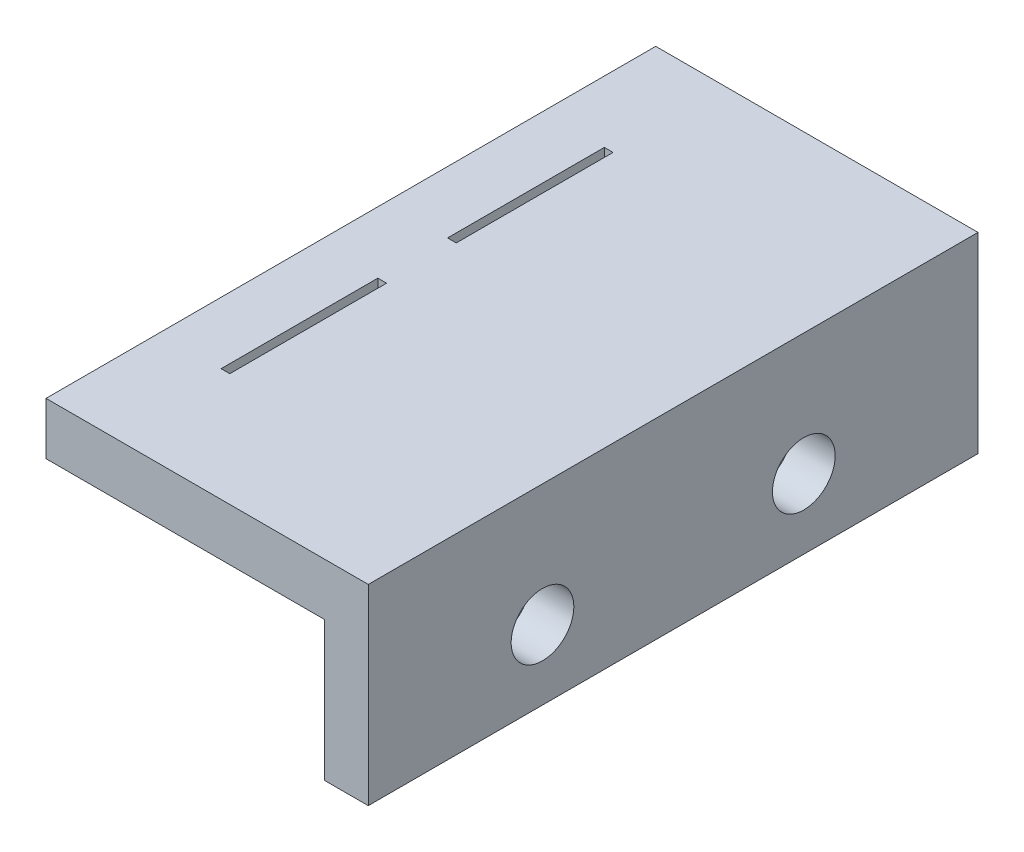
ISO-10303-21;
HEADER;
FILE_DESCRIPTION(('STEP AP214'),'2;1');
FILE_NAME('part.step','',(''),(''),'','','');
FILE_SCHEMA(('AUTOMOTIVE_DESIGN { 1 0 10303 214 1 1 1 1 }'));
ENDSEC;
DATA;
#1=APPLICATION_CONTEXT('core data for automotive mechanical design processes');
#2=APPLICATION_PROTOCOL_DEFINITION('international standard','automotive_design',2000,#1);
#3=PRODUCT_CONTEXT('',#1,'mechanical');
#4=PRODUCT('Part','Part','',(#3));
#5=PRODUCT_RELATED_PRODUCT_CATEGORY('part','',(#4));
#6=PRODUCT_DEFINITION_FORMATION('','',#4);
#7=PRODUCT_DEFINITION_CONTEXT('part definition',#1,'design');
#8=PRODUCT_DEFINITION('design','',#6,#7);
#9=PRODUCT_DEFINITION_SHAPE('','',#8);
#10=(LENGTH_UNIT() NAMED_UNIT(*) SI_UNIT(.MILLI.,.METRE.));
#11=(NAMED_UNIT(*) PLANE_ANGLE_UNIT() SI_UNIT($,.RADIAN.));
#12=(NAMED_UNIT(*) SI_UNIT($,.STERADIAN.) SOLID_ANGLE_UNIT());
#13=UNCERTAINTY_MEASURE_WITH_UNIT(LENGTH_MEASURE(1.E-05),#10,'distance_accuracy_value','');
#14=(GEOMETRIC_REPRESENTATION_CONTEXT(3) GLOBAL_UNCERTAINTY_ASSIGNED_CONTEXT((#13)) GLOBAL_UNIT_ASSIGNED_CONTEXT((#10,
#11,#12)) REPRESENTATION_CONTEXT('',''));
#15=CARTESIAN_POINT('',(0.,0.,0.));
#16=DIRECTION('',(0.,0.,1.));
#17=DIRECTION('',(1.,0.,0.));
#18=AXIS2_PLACEMENT_3D('',#15,#16,#17);
#19=CARTESIAN_POINT('',(0.,30.,0.));
#20=DIRECTION('',(0.,1.,0.));
#21=DIRECTION('',(0.,0.,1.));
#22=AXIS2_PLACEMENT_3D('',#19,#20,#21);
#23=PLANE('',#22);
#24=DIRECTION('',(-1.,0.,0.));
#25=VECTOR('',#24,1.);
#26=CARTESIAN_POINT('',(57.95,30.,-55.5));
#27=LINE('',#26,#25);
#28=CARTESIAN_POINT('',(58.45,30.,-55.5));
#29=VERTEX_POINT('',#28);
#30=CARTESIAN_POINT('',(57.95,30.,-55.5));
#31=VERTEX_POINT('',#30);
#32=EDGE_CURVE('E241',#29,#31,#27,.T.);
#33=ORIENTED_EDGE('',*,*,#32,.T.);
#34=DIRECTION('',(0.,0.,1.));
#35=VECTOR('',#34,1.);
#36=CARTESIAN_POINT('',(57.95,30.,-55.5));
#37=LINE('',#36,#35);
#38=CARTESIAN_POINT('',(57.95,30.,-46.5));
#39=VERTEX_POINT('',#38);
#40=EDGE_CURVE('E231',#31,#39,#37,.T.);
#41=ORIENTED_EDGE('',*,*,#40,.T.);
#42=DIRECTION('',(1.,0.,0.));
#43=VECTOR('',#42,1.);
#44=CARTESIAN_POINT('',(57.95,30.,-46.5));
#45=LINE('',#44,#43);
#46=CARTESIAN_POINT('',(58.45,30.,-46.5));
#47=VERTEX_POINT('',#46);
#48=EDGE_CURVE('E234',#39,#47,#45,.T.);
#49=ORIENTED_EDGE('',*,*,#48,.T.);
#50=DIRECTION('',(0.,0.,-1.));
#51=VECTOR('',#50,1.);
#52=CARTESIAN_POINT('',(58.45,30.,-55.5));
#53=LINE('',#52,#51);
#54=EDGE_CURVE('E238',#47,#29,#53,.T.);
#55=ORIENTED_EDGE('',*,*,#54,.T.);
#56=EDGE_LOOP('',(#33,#41,#49,#55));
#57=FACE_BOUND('',#56,.T.);
#58=DIRECTION('',(-1.,0.,0.));
#59=VECTOR('',#58,1.);
#60=CARTESIAN_POINT('',(57.95,30.,-42.5));
#61=LINE('',#60,#59);
#62=CARTESIAN_POINT('',(58.45,30.,-42.5));
#63=VERTEX_POINT('',#62);
#64=CARTESIAN_POINT('',(57.95,30.,-42.5));
#65=VERTEX_POINT('',#64);
#66=EDGE_CURVE('E209',#63,#65,#61,.T.);
#67=ORIENTED_EDGE('',*,*,#66,.T.);
#68=DIRECTION('',(0.,0.,1.));
#69=VECTOR('',#68,1.);
#70=CARTESIAN_POINT('',(57.95,30.,-42.5));
#71=LINE('',#70,#69);
#72=CARTESIAN_POINT('',(57.95,30.,-33.5));
#73=VERTEX_POINT('',#72);
#74=EDGE_CURVE('E199',#65,#73,#71,.T.);
#75=ORIENTED_EDGE('',*,*,#74,.T.);
#76=DIRECTION('',(1.,0.,0.));
#77=VECTOR('',#76,1.);
#78=CARTESIAN_POINT('',(57.95,30.,-33.5));
#79=LINE('',#78,#77);
#80=CARTESIAN_POINT('',(58.45,30.,-33.5));
#81=VERTEX_POINT('',#80);
#82=EDGE_CURVE('E202',#73,#81,#79,.T.);
#83=ORIENTED_EDGE('',*,*,#82,.T.);
#84=DIRECTION('',(0.,0.,-1.));
#85=VECTOR('',#84,1.);
#86=CARTESIAN_POINT('',(58.45,30.,-42.5));
#87=LINE('',#86,#85);
#88=EDGE_CURVE('E206',#81,#63,#87,.T.);
#89=ORIENTED_EDGE('',*,*,#88,.T.);
#90=EDGE_LOOP('',(#67,#75,#83,#89));
#91=FACE_BOUND('',#90,.T.);
#92=DIRECTION('',(0.,0.,-1.));
#93=VECTOR('',#92,1.);
#94=CARTESIAN_POINT('',(70.4,30.,-27.));
#95=LINE('',#94,#93);
#96=CARTESIAN_POINT('',(70.4,30.,-27.));
#97=VERTEX_POINT('',#96);
#98=CARTESIAN_POINT('',(70.4,30.,-62.));
#99=VERTEX_POINT('',#98);
#100=EDGE_CURVE('E53',#97,#99,#95,.T.);
#101=ORIENTED_EDGE('',*,*,#100,.F.);
#102=DIRECTION('',(1.,0.,0.));
#103=VECTOR('',#102,1.);
#104=CARTESIAN_POINT('',(35.2,30.,-27.));
#105=LINE('',#104,#103);
#106=CARTESIAN_POINT('',(54.4,30.,-27.));
#107=VERTEX_POINT('',#106);
#108=EDGE_CURVE('E256',#107,#97,#105,.T.);
#109=ORIENTED_EDGE('',*,*,#108,.F.);
#110=DIRECTION('',(0.,0.,-1.));
#111=VECTOR('',#110,1.);
#112=CARTESIAN_POINT('',(54.4,30.,-62.));
#113=LINE('',#112,#111);
#114=CARTESIAN_POINT('',(54.4,30.,-62.));
#115=VERTEX_POINT('',#114);
#116=EDGE_CURVE('E190',#107,#115,#113,.T.);
#117=ORIENTED_EDGE('',*,*,#116,.T.);
#118=DIRECTION('',(-1.,0.,0.));
#119=VECTOR('',#118,1.);
#120=CARTESIAN_POINT('',(70.4,30.,-62.));
#121=LINE('',#120,#119);
#122=EDGE_CURVE('E178',#99,#115,#121,.T.);
#123=ORIENTED_EDGE('',*,*,#122,.F.);
#124=EDGE_LOOP('',(#101,#109,#117,#123));
#125=FACE_BOUND('',#124,.T.);
#126=ADVANCED_FACE('F36',(#57,#91,#125),#23,.F.);
#127=CARTESIAN_POINT('',(0.,0.,-62.));
#128=DIRECTION('',(0.,0.,-1.));
#129=DIRECTION('',(-1.,0.,0.));
#130=AXIS2_PLACEMENT_3D('',#127,#128,#129);
#131=PLANE('',#130);
#132=DIRECTION('',(-1.,0.,0.));
#133=VECTOR('',#132,1.);
#134=CARTESIAN_POINT('',(70.4,33.,-62.));
#135=LINE('',#134,#133);
#136=CARTESIAN_POINT('',(72.9,33.,-62.));
#137=VERTEX_POINT('',#136);
#138=CARTESIAN_POINT('',(54.4,33.,-62.));
#139=VERTEX_POINT('',#138);
#140=EDGE_CURVE('E45',#137,#139,#135,.T.);
#141=ORIENTED_EDGE('',*,*,#140,.F.);
#142=DIRECTION('',(0.,1.,0.));
#143=VECTOR('',#142,1.);
#144=CARTESIAN_POINT('',(72.9,33.,-62.));
#145=LINE('',#144,#143);
#146=CARTESIAN_POINT('',(72.9,22.,-62.));
#147=VERTEX_POINT('',#146);
#148=EDGE_CURVE('E150',#147,#137,#145,.T.);
#149=ORIENTED_EDGE('',*,*,#148,.F.);
#150=DIRECTION('',(1.,0.,0.));
#151=VECTOR('',#150,1.);
#152=CARTESIAN_POINT('',(72.9,22.,-62.));
#153=LINE('',#152,#151);
#154=CARTESIAN_POINT('',(70.4,22.,-62.));
#155=VERTEX_POINT('',#154);
#156=EDGE_CURVE('E164',#155,#147,#153,.T.);
#157=ORIENTED_EDGE('',*,*,#156,.F.);
#158=DIRECTION('',(0.,1.,0.));
#159=VECTOR('',#158,1.);
#160=CARTESIAN_POINT('',(70.4,22.,-62.));
#161=LINE('',#160,#159);
#162=EDGE_CURVE('E173',#155,#99,#161,.T.);
#163=ORIENTED_EDGE('',*,*,#162,.T.);
#164=ORIENTED_EDGE('',*,*,#122,.T.);
#165=DIRECTION('',(0.,1.,0.));
#166=VECTOR('',#165,1.);
#167=CARTESIAN_POINT('',(54.4,30.,-62.));
#168=LINE('',#167,#166);
#169=EDGE_CURVE('E195',#115,#139,#168,.T.);
#170=ORIENTED_EDGE('',*,*,#169,.T.);
#171=EDGE_LOOP('',(#141,#149,#157,#163,#164,#170));
#172=FACE_BOUND('',#171,.T.);
#173=ADVANCED_FACE('F38',(#172),#131,.T.);
#174=CARTESIAN_POINT('',(0.,30.,-27.));
#175=DIRECTION('',(0.,0.,-1.));
#176=DIRECTION('',(-1.,0.,0.));
#177=AXIS2_PLACEMENT_3D('',#174,#175,#176);
#178=PLANE('',#177);
#179=ORIENTED_EDGE('',*,*,#108,.T.);
#180=DIRECTION('',(0.,1.,0.));
#181=VECTOR('',#180,1.);
#182=CARTESIAN_POINT('',(70.4,22.,-27.));
#183=LINE('',#182,#181);
#184=CARTESIAN_POINT('',(70.4,22.,-27.));
#185=VERTEX_POINT('',#184);
#186=EDGE_CURVE('E151',#185,#97,#183,.T.);
#187=ORIENTED_EDGE('',*,*,#186,.F.);
#188=DIRECTION('',(-1.,0.,0.));
#189=VECTOR('',#188,1.);
#190=CARTESIAN_POINT('',(72.9,22.,-27.));
#191=LINE('',#190,#189);
#192=CARTESIAN_POINT('',(72.9,22.,-27.));
#193=VERTEX_POINT('',#192);
#194=EDGE_CURVE('E154',#193,#185,#191,.T.);
#195=ORIENTED_EDGE('',*,*,#194,.F.);
#196=DIRECTION('',(0.,-1.,0.));
#197=VECTOR('',#196,1.);
#198=CARTESIAN_POINT('',(72.9,33.,-27.));
#199=LINE('',#198,#197);
#200=CARTESIAN_POINT('',(72.9,33.,-27.));
#201=VERTEX_POINT('',#200);
#202=EDGE_CURVE('E140',#201,#193,#199,.T.);
#203=ORIENTED_EDGE('',*,*,#202,.F.);
#204=DIRECTION('',(1.,0.,0.));
#205=VECTOR('',#204,1.);
#206=CARTESIAN_POINT('',(35.2,33.,-27.));
#207=LINE('',#206,#205);
#208=CARTESIAN_POINT('',(54.4,33.,-27.));
#209=VERTEX_POINT('',#208);
#210=EDGE_CURVE('E263',#209,#201,#207,.T.);
#211=ORIENTED_EDGE('',*,*,#210,.F.);
#212=DIRECTION('',(0.,-1.,0.));
#213=VECTOR('',#212,1.);
#214=CARTESIAN_POINT('',(54.4,30.,-27.));
#215=LINE('',#214,#213);
#216=EDGE_CURVE('E60',#209,#107,#215,.T.);
#217=ORIENTED_EDGE('',*,*,#216,.T.);
#218=EDGE_LOOP('',(#179,#187,#195,#203,#211,#217));
#219=FACE_BOUND('',#218,.T.);
#220=ADVANCED_FACE('F155',(#219),#178,.F.);
#221=CARTESIAN_POINT('',(0.,33.,0.));
#222=DIRECTION('',(0.,1.,0.));
#223=DIRECTION('',(0.,0.,1.));
#224=AXIS2_PLACEMENT_3D('',#221,#222,#223);
#225=PLANE('',#224);
#226=DIRECTION('',(0.,0.,-1.));
#227=VECTOR('',#226,1.);
#228=CARTESIAN_POINT('',(54.4,33.,0.));
#229=LINE('',#228,#227);
#230=EDGE_CURVE('E11',#209,#139,#229,.T.);
#231=ORIENTED_EDGE('',*,*,#230,.F.);
#232=ORIENTED_EDGE('',*,*,#210,.T.);
#233=DIRECTION('',(0.,0.,1.));
#234=VECTOR('',#233,1.);
#235=CARTESIAN_POINT('',(72.9,33.,-27.));
#236=LINE('',#235,#234);
#237=EDGE_CURVE('E147',#137,#201,#236,.T.);
#238=ORIENTED_EDGE('',*,*,#237,.F.);
#239=ORIENTED_EDGE('',*,*,#140,.T.);
#240=EDGE_LOOP('',(#231,#232,#238,#239));
#241=FACE_BOUND('',#240,.T.);
#242=DIRECTION('',(0.,0.,1.));
#243=VECTOR('',#242,1.);
#244=CARTESIAN_POINT('',(57.95,33.,-42.5));
#245=LINE('',#244,#243);
#246=CARTESIAN_POINT('',(57.95,33.,-42.5));
#247=VERTEX_POINT('',#246);
#248=CARTESIAN_POINT('',(57.95,33.,-33.5));
#249=VERTEX_POINT('',#248);
#250=EDGE_CURVE('E198',#247,#249,#245,.T.);
#251=ORIENTED_EDGE('',*,*,#250,.F.);
#252=DIRECTION('',(-1.,0.,0.));
#253=VECTOR('',#252,1.);
#254=CARTESIAN_POINT('',(57.95,33.,-42.5));
#255=LINE('',#254,#253);
#256=CARTESIAN_POINT('',(58.45,33.,-42.5));
#257=VERTEX_POINT('',#256);
#258=EDGE_CURVE('E203',#257,#247,#255,.T.);
#259=ORIENTED_EDGE('',*,*,#258,.F.);
#260=DIRECTION('',(0.,0.,-1.));
#261=VECTOR('',#260,1.);
#262=CARTESIAN_POINT('',(58.45,33.,-42.5));
#263=LINE('',#262,#261);
#264=CARTESIAN_POINT('',(58.45,33.,-33.5));
#265=VERTEX_POINT('',#264);
#266=EDGE_CURVE('E217',#265,#257,#263,.T.);
#267=ORIENTED_EDGE('',*,*,#266,.F.);
#268=DIRECTION('',(1.,0.,0.));
#269=VECTOR('',#268,1.);
#270=CARTESIAN_POINT('',(57.95,33.,-33.5));
#271=LINE('',#270,#269);
#272=EDGE_CURVE('E214',#249,#265,#271,.T.);
#273=ORIENTED_EDGE('',*,*,#272,.F.);
#274=EDGE_LOOP('',(#251,#259,#267,#273));
#275=FACE_BOUND('',#274,.T.);
#276=DIRECTION('',(0.,0.,1.));
#277=VECTOR('',#276,1.);
#278=CARTESIAN_POINT('',(57.95,33.,-55.5));
#279=LINE('',#278,#277);
#280=CARTESIAN_POINT('',(57.95,33.,-55.5));
#281=VERTEX_POINT('',#280);
#282=CARTESIAN_POINT('',(57.95,33.,-46.5));
#283=VERTEX_POINT('',#282);
#284=EDGE_CURVE('E224',#281,#283,#279,.T.);
#285=ORIENTED_EDGE('',*,*,#284,.F.);
#286=DIRECTION('',(-1.,0.,0.));
#287=VECTOR('',#286,1.);
#288=CARTESIAN_POINT('',(57.95,33.,-55.5));
#289=LINE('',#288,#287);
#290=CARTESIAN_POINT('',(58.45,33.,-55.5));
#291=VERTEX_POINT('',#290);
#292=EDGE_CURVE('E235',#291,#281,#289,.T.);
#293=ORIENTED_EDGE('',*,*,#292,.F.);
#294=DIRECTION('',(0.,0.,-1.));
#295=VECTOR('',#294,1.);
#296=CARTESIAN_POINT('',(58.45,33.,-55.5));
#297=LINE('',#296,#295);
#298=CARTESIAN_POINT('',(58.45,33.,-46.5));
#299=VERTEX_POINT('',#298);
#300=EDGE_CURVE('E249',#299,#291,#297,.T.);
#301=ORIENTED_EDGE('',*,*,#300,.F.);
#302=DIRECTION('',(1.,0.,0.));
#303=VECTOR('',#302,1.);
#304=CARTESIAN_POINT('',(57.95,33.,-46.5));
#305=LINE('',#304,#303);
#306=EDGE_CURVE('E246',#283,#299,#305,.T.);
#307=ORIENTED_EDGE('',*,*,#306,.F.);
#308=EDGE_LOOP('',(#285,#293,#301,#307));
#309=FACE_BOUND('',#308,.T.);
#310=ADVANCED_FACE('F278',(#241,#275,#309),#225,.T.);
#311=CARTESIAN_POINT('',(57.95,30.,-55.5));
#312=DIRECTION('',(-1.,0.,0.));
#313=DIRECTION('',(0.,0.,1.));
#314=AXIS2_PLACEMENT_3D('',#311,#312,#313);
#315=PLANE('',#314);
#316=ORIENTED_EDGE('',*,*,#284,.T.);
#317=DIRECTION('',(0.,1.,0.));
#318=VECTOR('',#317,1.);
#319=CARTESIAN_POINT('',(57.95,30.,-46.5));
#320=LINE('',#319,#318);
#321=EDGE_CURVE('E244',#39,#283,#320,.T.);
#322=ORIENTED_EDGE('',*,*,#321,.F.);
#323=ORIENTED_EDGE('',*,*,#40,.F.);
#324=DIRECTION('',(0.,1.,0.));
#325=VECTOR('',#324,1.);
#326=CARTESIAN_POINT('',(57.95,30.,-55.5));
#327=LINE('',#326,#325);
#328=EDGE_CURVE('E254',#31,#281,#327,.T.);
#329=ORIENTED_EDGE('',*,*,#328,.T.);
#330=EDGE_LOOP('',(#316,#322,#323,#329));
#331=FACE_BOUND('',#330,.T.);
#332=ADVANCED_FACE('F284',(#331),#315,.F.);
#333=CARTESIAN_POINT('',(57.95,30.,-55.5));
#334=DIRECTION('',(0.,0.,-1.));
#335=DIRECTION('',(-1.,0.,0.));
#336=AXIS2_PLACEMENT_3D('',#333,#334,#335);
#337=PLANE('',#336);
#338=ORIENTED_EDGE('',*,*,#292,.T.);
#339=ORIENTED_EDGE('',*,*,#328,.F.);
#340=ORIENTED_EDGE('',*,*,#32,.F.);
#341=DIRECTION('',(0.,1.,0.));
#342=VECTOR('',#341,1.);
#343=CARTESIAN_POINT('',(58.45,30.,-55.5));
#344=LINE('',#343,#342);
#345=EDGE_CURVE('E257',#29,#291,#344,.T.);
#346=ORIENTED_EDGE('',*,*,#345,.T.);
#347=EDGE_LOOP('',(#338,#339,#340,#346));
#348=FACE_BOUND('',#347,.T.);
#349=ADVANCED_FACE('F289',(#348),#337,.F.);
#350=CARTESIAN_POINT('',(58.45,30.,-55.5));
#351=DIRECTION('',(1.,0.,0.));
#352=DIRECTION('',(0.,0.,-1.));
#353=AXIS2_PLACEMENT_3D('',#350,#351,#352);
#354=PLANE('',#353);
#355=ORIENTED_EDGE('',*,*,#300,.T.);
#356=ORIENTED_EDGE('',*,*,#345,.F.);
#357=ORIENTED_EDGE('',*,*,#54,.F.);
#358=DIRECTION('',(0.,1.,0.));
#359=VECTOR('',#358,1.);
#360=CARTESIAN_POINT('',(58.45,30.,-46.5));
#361=LINE('',#360,#359);
#362=EDGE_CURVE('E259',#47,#299,#361,.T.);
#363=ORIENTED_EDGE('',*,*,#362,.T.);
#364=EDGE_LOOP('',(#355,#356,#357,#363));
#365=FACE_BOUND('',#364,.T.);
#366=ADVANCED_FACE('F308',(#365),#354,.F.);
#367=CARTESIAN_POINT('',(57.95,30.,-46.5));
#368=DIRECTION('',(0.,0.,1.));
#369=DIRECTION('',(1.,0.,0.));
#370=AXIS2_PLACEMENT_3D('',#367,#368,#369);
#371=PLANE('',#370);
#372=ORIENTED_EDGE('',*,*,#306,.T.);
#373=ORIENTED_EDGE('',*,*,#362,.F.);
#374=ORIENTED_EDGE('',*,*,#48,.F.);
#375=ORIENTED_EDGE('',*,*,#321,.T.);
#376=EDGE_LOOP('',(#372,#373,#374,#375));
#377=FACE_BOUND('',#376,.T.);
#378=ADVANCED_FACE('F303',(#377),#371,.F.);
#379=CARTESIAN_POINT('',(57.95,30.,-42.5));
#380=DIRECTION('',(-1.,0.,0.));
#381=DIRECTION('',(0.,0.,1.));
#382=AXIS2_PLACEMENT_3D('',#379,#380,#381);
#383=PLANE('',#382);
#384=ORIENTED_EDGE('',*,*,#250,.T.);
#385=DIRECTION('',(0.,1.,0.));
#386=VECTOR('',#385,1.);
#387=CARTESIAN_POINT('',(57.95,30.,-33.5));
#388=LINE('',#387,#386);
#389=EDGE_CURVE('E212',#73,#249,#388,.T.);
#390=ORIENTED_EDGE('',*,*,#389,.F.);
#391=ORIENTED_EDGE('',*,*,#74,.F.);
#392=DIRECTION('',(0.,1.,0.));
#393=VECTOR('',#392,1.);
#394=CARTESIAN_POINT('',(57.95,30.,-42.5));
#395=LINE('',#394,#393);
#396=EDGE_CURVE('E222',#65,#247,#395,.T.);
#397=ORIENTED_EDGE('',*,*,#396,.T.);
#398=EDGE_LOOP('',(#384,#390,#391,#397));
#399=FACE_BOUND('',#398,.T.);
#400=ADVANCED_FACE('F315',(#399),#383,.F.);
#401=CARTESIAN_POINT('',(57.95,30.,-42.5));
#402=DIRECTION('',(0.,0.,-1.));
#403=DIRECTION('',(-1.,0.,0.));
#404=AXIS2_PLACEMENT_3D('',#401,#402,#403);
#405=PLANE('',#404);
#406=ORIENTED_EDGE('',*,*,#258,.T.);
#407=ORIENTED_EDGE('',*,*,#396,.F.);
#408=ORIENTED_EDGE('',*,*,#66,.F.);
#409=DIRECTION('',(0.,1.,0.));
#410=VECTOR('',#409,1.);
#411=CARTESIAN_POINT('',(58.45,30.,-42.5));
#412=LINE('',#411,#410);
#413=EDGE_CURVE('E225',#63,#257,#412,.T.);
#414=ORIENTED_EDGE('',*,*,#413,.T.);
#415=EDGE_LOOP('',(#406,#407,#408,#414));
#416=FACE_BOUND('',#415,.T.);
#417=ADVANCED_FACE('F321',(#416),#405,.F.);
#418=CARTESIAN_POINT('',(58.45,30.,-42.5));
#419=DIRECTION('',(1.,0.,0.));
#420=DIRECTION('',(0.,0.,-1.));
#421=AXIS2_PLACEMENT_3D('',#418,#419,#420);
#422=PLANE('',#421);
#423=ORIENTED_EDGE('',*,*,#266,.T.);
#424=ORIENTED_EDGE('',*,*,#413,.F.);
#425=ORIENTED_EDGE('',*,*,#88,.F.);
#426=DIRECTION('',(0.,1.,0.));
#427=VECTOR('',#426,1.);
#428=CARTESIAN_POINT('',(58.45,30.,-33.5));
#429=LINE('',#428,#427);
#430=EDGE_CURVE('E227',#81,#265,#429,.T.);
#431=ORIENTED_EDGE('',*,*,#430,.T.);
#432=EDGE_LOOP('',(#423,#424,#425,#431));
#433=FACE_BOUND('',#432,.T.);
#434=ADVANCED_FACE('F326',(#433),#422,.F.);
#435=CARTESIAN_POINT('',(57.95,30.,-33.5));
#436=DIRECTION('',(0.,0.,1.));
#437=DIRECTION('',(1.,0.,0.));
#438=AXIS2_PLACEMENT_3D('',#435,#436,#437);
#439=PLANE('',#438);
#440=ORIENTED_EDGE('',*,*,#272,.T.);
#441=ORIENTED_EDGE('',*,*,#430,.F.);
#442=ORIENTED_EDGE('',*,*,#82,.F.);
#443=ORIENTED_EDGE('',*,*,#389,.T.);
#444=EDGE_LOOP('',(#440,#441,#442,#443));
#445=FACE_BOUND('',#444,.T.);
#446=ADVANCED_FACE('F323',(#445),#439,.F.);
#447=CARTESIAN_POINT('',(54.4,30.,-62.));
#448=DIRECTION('',(1.,0.,0.));
#449=DIRECTION('',(0.,0.,-1.));
#450=AXIS2_PLACEMENT_3D('',#447,#448,#449);
#451=PLANE('',#450);
#452=ORIENTED_EDGE('',*,*,#230,.T.);
#453=ORIENTED_EDGE('',*,*,#169,.F.);
#454=ORIENTED_EDGE('',*,*,#116,.F.);
#455=ORIENTED_EDGE('',*,*,#216,.F.);
#456=EDGE_LOOP('',(#452,#453,#454,#455));
#457=FACE_BOUND('',#456,.T.);
#458=ADVANCED_FACE('F269',(#457),#451,.F.);
#459=CARTESIAN_POINT('',(72.9,0.,0.));
#460=DIRECTION('',(1.,0.,0.));
#461=DIRECTION('',(0.,0.,-1.));
#462=AXIS2_PLACEMENT_3D('',#459,#460,#461);
#463=PLANE('',#462);
#464=CARTESIAN_POINT('',(72.9,26.,-52.));
#465=DIRECTION('',(1.,0.,0.));
#466=DIRECTION('',(0.,0.,-1.));
#467=AXIS2_PLACEMENT_3D('',#464,#465,#466);
#468=CIRCLE('',#467,1.8);
#469=CARTESIAN_POINT('',(72.9,26.,-53.8));
#470=VERTEX_POINT('',#469);
#471=EDGE_CURVE('E356',#470,#470,#468,.T.);
#472=ORIENTED_EDGE('',*,*,#471,.F.);
#473=EDGE_LOOP('',(#472));
#474=FACE_BOUND('',#473,.T.);
#475=CARTESIAN_POINT('',(72.9,26.,-37.));
#476=DIRECTION('',(1.,0.,0.));
#477=DIRECTION('',(0.,0.,-1.));
#478=AXIS2_PLACEMENT_3D('',#475,#476,#477);
#479=CIRCLE('',#478,1.8);
#480=CARTESIAN_POINT('',(72.9,26.,-38.8));
#481=VERTEX_POINT('',#480);
#482=EDGE_CURVE('E166',#481,#481,#479,.T.);
#483=ORIENTED_EDGE('',*,*,#482,.F.);
#484=EDGE_LOOP('',(#483));
#485=FACE_BOUND('',#484,.T.);
#486=ORIENTED_EDGE('',*,*,#202,.T.);
#487=DIRECTION('',(0.,0.,1.));
#488=VECTOR('',#487,1.);
#489=CARTESIAN_POINT('',(72.9,22.,-27.));
#490=LINE('',#489,#488);
#491=EDGE_CURVE('E145',#147,#193,#490,.T.);
#492=ORIENTED_EDGE('',*,*,#491,.F.);
#493=ORIENTED_EDGE('',*,*,#148,.T.);
#494=ORIENTED_EDGE('',*,*,#237,.T.);
#495=EDGE_LOOP('',(#486,#492,#493,#494));
#496=FACE_BOUND('',#495,.T.);
#497=ADVANCED_FACE('F142',(#474,#485,#496),#463,.T.);
#498=CARTESIAN_POINT('',(70.4,22.,-27.));
#499=DIRECTION('',(1.,0.,0.));
#500=DIRECTION('',(0.,0.,-1.));
#501=AXIS2_PLACEMENT_3D('',#498,#499,#500);
#502=PLANE('',#501);
#503=CARTESIAN_POINT('',(70.4,26.,-52.));
#504=DIRECTION('',(-1.,0.,0.));
#505=DIRECTION('',(0.,0.,1.));
#506=AXIS2_PLACEMENT_3D('',#503,#504,#505);
#507=CIRCLE('',#506,1.8);
#508=CARTESIAN_POINT('',(70.4,26.,-50.2));
#509=VERTEX_POINT('',#508);
#510=EDGE_CURVE('E359',#509,#509,#507,.T.);
#511=ORIENTED_EDGE('',*,*,#510,.F.);
#512=EDGE_LOOP('',(#511));
#513=FACE_BOUND('',#512,.T.);
#514=CARTESIAN_POINT('',(70.4,26.,-37.));
#515=DIRECTION('',(-1.,0.,0.));
#516=DIRECTION('',(0.,0.,1.));
#517=AXIS2_PLACEMENT_3D('',#514,#515,#516);
#518=CIRCLE('',#517,1.8);
#519=CARTESIAN_POINT('',(70.4,26.,-35.2));
#520=VERTEX_POINT('',#519);
#521=EDGE_CURVE('E361',#520,#520,#518,.T.);
#522=ORIENTED_EDGE('',*,*,#521,.F.);
#523=EDGE_LOOP('',(#522));
#524=FACE_BOUND('',#523,.T.);
#525=ORIENTED_EDGE('',*,*,#100,.T.);
#526=ORIENTED_EDGE('',*,*,#162,.F.);
#527=DIRECTION('',(0.,0.,-1.));
#528=VECTOR('',#527,1.);
#529=CARTESIAN_POINT('',(70.4,22.,-27.));
#530=LINE('',#529,#528);
#531=EDGE_CURVE('E159',#185,#155,#530,.T.);
#532=ORIENTED_EDGE('',*,*,#531,.F.);
#533=ORIENTED_EDGE('',*,*,#186,.T.);
#534=EDGE_LOOP('',(#525,#526,#532,#533));
#535=FACE_BOUND('',#534,.T.);
#536=ADVANCED_FACE('F185',(#513,#524,#535),#502,.F.);
#537=CARTESIAN_POINT('',(0.,22.,0.));
#538=DIRECTION('',(0.,1.,0.));
#539=DIRECTION('',(0.,0.,1.));
#540=AXIS2_PLACEMENT_3D('',#537,#538,#539);
#541=PLANE('',#540);
#542=ORIENTED_EDGE('',*,*,#491,.T.);
#543=ORIENTED_EDGE('',*,*,#194,.T.);
#544=ORIENTED_EDGE('',*,*,#531,.T.);
#545=ORIENTED_EDGE('',*,*,#156,.T.);
#546=EDGE_LOOP('',(#542,#543,#544,#545));
#547=FACE_BOUND('',#546,.T.);
#548=ADVANCED_FACE('F162',(#547),#541,.F.);
#549=CARTESIAN_POINT('',(80.4,26.,-37.));
#550=DIRECTION('',(-1.,0.,0.));
#551=DIRECTION('',(0.,0.,1.));
#552=AXIS2_PLACEMENT_3D('',#549,#550,#551);
#553=CYLINDRICAL_SURFACE('',#552,1.8);
#554=ORIENTED_EDGE('',*,*,#482,.T.);
#555=EDGE_LOOP('',(#554));
#556=FACE_BOUND('',#555,.T.);
#557=ORIENTED_EDGE('',*,*,#521,.T.);
#558=EDGE_LOOP('',(#557));
#559=FACE_BOUND('',#558,.T.);
#560=ADVANCED_FACE('F344',(#556,#559),#553,.F.);
#561=CARTESIAN_POINT('',(80.4,26.,-52.));
#562=DIRECTION('',(-1.,0.,0.));
#563=DIRECTION('',(0.,0.,1.));
#564=AXIS2_PLACEMENT_3D('',#561,#562,#563);
#565=CYLINDRICAL_SURFACE('',#564,1.8);
#566=ORIENTED_EDGE('',*,*,#471,.T.);
#567=EDGE_LOOP('',(#566));
#568=FACE_BOUND('',#567,.T.);
#569=ORIENTED_EDGE('',*,*,#510,.T.);
#570=EDGE_LOOP('',(#569));
#571=FACE_BOUND('',#570,.T.);
#572=ADVANCED_FACE('F347',(#568,#571),#565,.F.);
#573=CLOSED_SHELL('',(#126,#173,#220,#310,#332,#349,#366,#378,#400,#417,#434,#446,#458,#497,
#536,#548,#560,#572));
#574=MANIFOLD_SOLID_BREP('B2',#573);
#575=ADVANCED_BREP_SHAPE_REPRESENTATION('',(#18,#574),#14);
#576=SHAPE_DEFINITION_REPRESENTATION(#9,#575);
ENDSEC;
END-ISO-10303-21;
